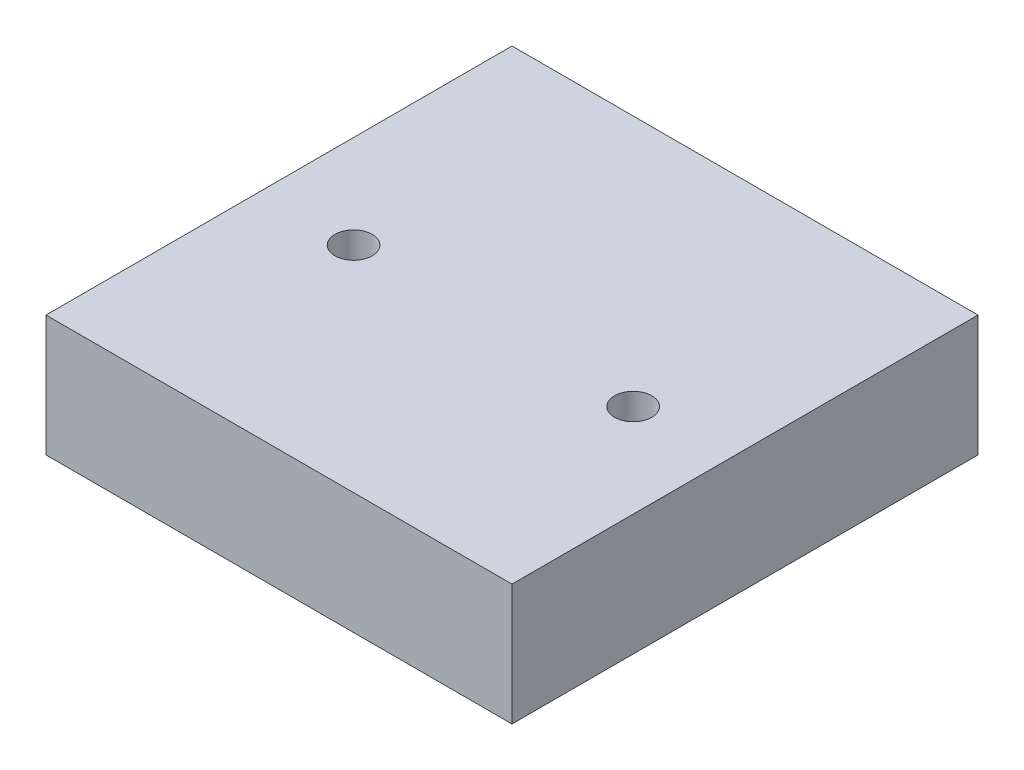
ISO-10303-21;
HEADER;
FILE_DESCRIPTION(('STEP AP214'),'2;1');
FILE_NAME('part.step','',(''),(''),'','','');
FILE_SCHEMA(('AUTOMOTIVE_DESIGN { 1 0 10303 214 1 1 1 1 }'));
ENDSEC;
DATA;
#1=APPLICATION_CONTEXT('core data for automotive mechanical design processes');
#2=APPLICATION_PROTOCOL_DEFINITION('international standard','automotive_design',2000,#1);
#3=PRODUCT_CONTEXT('',#1,'mechanical');
#4=PRODUCT('Part','Part','',(#3));
#5=PRODUCT_RELATED_PRODUCT_CATEGORY('part','',(#4));
#6=PRODUCT_DEFINITION_FORMATION('','',#4);
#7=PRODUCT_DEFINITION_CONTEXT('part definition',#1,'design');
#8=PRODUCT_DEFINITION('design','',#6,#7);
#9=PRODUCT_DEFINITION_SHAPE('','',#8);
#10=(LENGTH_UNIT() NAMED_UNIT(*) SI_UNIT(.MILLI.,.METRE.));
#11=(NAMED_UNIT(*) PLANE_ANGLE_UNIT() SI_UNIT($,.RADIAN.));
#12=(NAMED_UNIT(*) SI_UNIT($,.STERADIAN.) SOLID_ANGLE_UNIT());
#13=UNCERTAINTY_MEASURE_WITH_UNIT(LENGTH_MEASURE(1.E-05),#10,'distance_accuracy_value','');
#14=(GEOMETRIC_REPRESENTATION_CONTEXT(3) GLOBAL_UNCERTAINTY_ASSIGNED_CONTEXT((#13)) GLOBAL_UNIT_ASSIGNED_CONTEXT((#10,
#11,#12)) REPRESENTATION_CONTEXT('',''));
#15=CARTESIAN_POINT('',(0.,0.,0.));
#16=DIRECTION('',(0.,0.,1.));
#17=DIRECTION('',(1.,0.,0.));
#18=AXIS2_PLACEMENT_3D('',#15,#16,#17);
#19=CARTESIAN_POINT('',(25.,13.,25.));
#20=DIRECTION('',(-1.,0.,0.));
#21=DIRECTION('',(0.,0.,1.));
#22=AXIS2_PLACEMENT_3D('',#19,#20,#21);
#23=PLANE('',#22);
#24=DIRECTION('',(0.,0.,-1.));
#25=VECTOR('',#24,1.);
#26=CARTESIAN_POINT('',(25.,0.,25.));
#27=LINE('',#26,#25);
#28=CARTESIAN_POINT('',(25.,0.,25.));
#29=VERTEX_POINT('',#28);
#30=CARTESIAN_POINT('',(25.,0.,-25.));
#31=VERTEX_POINT('',#30);
#32=EDGE_CURVE('E102',#29,#31,#27,.T.);
#33=ORIENTED_EDGE('',*,*,#32,.T.);
#34=DIRECTION('',(0.,-1.,0.));
#35=VECTOR('',#34,1.);
#36=CARTESIAN_POINT('',(25.,13.,-25.));
#37=LINE('',#36,#35);
#38=CARTESIAN_POINT('',(25.,13.,-25.));
#39=VERTEX_POINT('',#38);
#40=EDGE_CURVE('E11',#39,#31,#37,.T.);
#41=ORIENTED_EDGE('',*,*,#40,.F.);
#42=DIRECTION('',(0.,0.,-1.));
#43=VECTOR('',#42,1.);
#44=CARTESIAN_POINT('',(25.,13.,25.));
#45=LINE('',#44,#43);
#46=CARTESIAN_POINT('',(25.,13.,25.));
#47=VERTEX_POINT('',#46);
#48=EDGE_CURVE('E90',#47,#39,#45,.T.);
#49=ORIENTED_EDGE('',*,*,#48,.F.);
#50=DIRECTION('',(0.,-1.,0.));
#51=VECTOR('',#50,1.);
#52=CARTESIAN_POINT('',(25.,13.,25.));
#53=LINE('',#52,#51);
#54=EDGE_CURVE('E98',#47,#29,#53,.T.);
#55=ORIENTED_EDGE('',*,*,#54,.T.);
#56=EDGE_LOOP('',(#33,#41,#49,#55));
#57=FACE_BOUND('',#56,.T.);
#58=ADVANCED_FACE('F39',(#57),#23,.F.);
#59=CARTESIAN_POINT('',(-25.,13.,-25.));
#60=DIRECTION('',(0.,0.,1.));
#61=DIRECTION('',(1.,0.,0.));
#62=AXIS2_PLACEMENT_3D('',#59,#60,#61);
#63=PLANE('',#62);
#64=DIRECTION('',(-1.,0.,0.));
#65=VECTOR('',#64,1.);
#66=CARTESIAN_POINT('',(-25.,0.,-25.));
#67=LINE('',#66,#65);
#68=CARTESIAN_POINT('',(-25.,0.,-25.));
#69=VERTEX_POINT('',#68);
#70=EDGE_CURVE('E94',#31,#69,#67,.T.);
#71=ORIENTED_EDGE('',*,*,#70,.T.);
#72=DIRECTION('',(0.,-1.,0.));
#73=VECTOR('',#72,1.);
#74=CARTESIAN_POINT('',(-25.,13.,-25.));
#75=LINE('',#74,#73);
#76=CARTESIAN_POINT('',(-25.,13.,-25.));
#77=VERTEX_POINT('',#76);
#78=EDGE_CURVE('E47',#77,#69,#75,.T.);
#79=ORIENTED_EDGE('',*,*,#78,.F.);
#80=DIRECTION('',(-1.,0.,0.));
#81=VECTOR('',#80,1.);
#82=CARTESIAN_POINT('',(-25.,13.,-25.));
#83=LINE('',#82,#81);
#84=EDGE_CURVE('E85',#39,#77,#83,.T.);
#85=ORIENTED_EDGE('',*,*,#84,.F.);
#86=ORIENTED_EDGE('',*,*,#40,.T.);
#87=EDGE_LOOP('',(#71,#79,#85,#86));
#88=FACE_BOUND('',#87,.T.);
#89=ADVANCED_FACE('F93',(#88),#63,.F.);
#90=CARTESIAN_POINT('',(-25.,13.,25.));
#91=DIRECTION('',(1.,0.,0.));
#92=DIRECTION('',(0.,0.,-1.));
#93=AXIS2_PLACEMENT_3D('',#90,#91,#92);
#94=PLANE('',#93);
#95=DIRECTION('',(0.,0.,1.));
#96=VECTOR('',#95,1.);
#97=CARTESIAN_POINT('',(-25.,0.,25.));
#98=LINE('',#97,#96);
#99=CARTESIAN_POINT('',(-25.,0.,25.));
#100=VERTEX_POINT('',#99);
#101=EDGE_CURVE('E72',#69,#100,#98,.T.);
#102=ORIENTED_EDGE('',*,*,#101,.T.);
#103=DIRECTION('',(0.,-1.,0.));
#104=VECTOR('',#103,1.);
#105=CARTESIAN_POINT('',(-25.,13.,25.));
#106=LINE('',#105,#104);
#107=CARTESIAN_POINT('',(-25.,13.,25.));
#108=VERTEX_POINT('',#107);
#109=EDGE_CURVE('E95',#108,#100,#106,.T.);
#110=ORIENTED_EDGE('',*,*,#109,.F.);
#111=DIRECTION('',(0.,0.,1.));
#112=VECTOR('',#111,1.);
#113=CARTESIAN_POINT('',(-25.,13.,25.));
#114=LINE('',#113,#112);
#115=EDGE_CURVE('E88',#77,#108,#114,.T.);
#116=ORIENTED_EDGE('',*,*,#115,.F.);
#117=ORIENTED_EDGE('',*,*,#78,.T.);
#118=EDGE_LOOP('',(#102,#110,#116,#117));
#119=FACE_BOUND('',#118,.T.);
#120=ADVANCED_FACE('F96',(#119),#94,.F.);
#121=CARTESIAN_POINT('',(-25.,13.,25.));
#122=DIRECTION('',(0.,0.,-1.));
#123=DIRECTION('',(-1.,0.,0.));
#124=AXIS2_PLACEMENT_3D('',#121,#122,#123);
#125=PLANE('',#124);
#126=DIRECTION('',(1.,0.,0.));
#127=VECTOR('',#126,1.);
#128=CARTESIAN_POINT('',(-25.,0.,25.));
#129=LINE('',#128,#127);
#130=EDGE_CURVE('E78',#100,#29,#129,.T.);
#131=ORIENTED_EDGE('',*,*,#130,.T.);
#132=ORIENTED_EDGE('',*,*,#54,.F.);
#133=DIRECTION('',(1.,0.,0.));
#134=VECTOR('',#133,1.);
#135=CARTESIAN_POINT('',(-25.,13.,25.));
#136=LINE('',#135,#134);
#137=EDGE_CURVE('E55',#108,#47,#136,.T.);
#138=ORIENTED_EDGE('',*,*,#137,.F.);
#139=ORIENTED_EDGE('',*,*,#109,.T.);
#140=EDGE_LOOP('',(#131,#132,#138,#139));
#141=FACE_BOUND('',#140,.T.);
#142=ADVANCED_FACE('F110',(#141),#125,.F.);
#143=CARTESIAN_POINT('',(0.,13.,0.));
#144=DIRECTION('',(0.,-1.,0.));
#145=DIRECTION('',(0.,0.,-1.));
#146=AXIS2_PLACEMENT_3D('',#143,#144,#145);
#147=PLANE('',#146);
#148=CARTESIAN_POINT('',(-15.,13.,2.));
#149=DIRECTION('',(0.,1.,0.));
#150=DIRECTION('',(0.,0.,1.));
#151=AXIS2_PLACEMENT_3D('',#148,#149,#150);
#152=CIRCLE('',#151,2.);
#153=CARTESIAN_POINT('',(-15.,13.,4.));
#154=VERTEX_POINT('',#153);
#155=EDGE_CURVE('E105',#154,#154,#152,.T.);
#156=ORIENTED_EDGE('',*,*,#155,.F.);
#157=EDGE_LOOP('',(#156));
#158=FACE_BOUND('',#157,.T.);
#159=CARTESIAN_POINT('',(15.,13.,2.));
#160=DIRECTION('',(0.,1.,0.));
#161=DIRECTION('',(0.,0.,1.));
#162=AXIS2_PLACEMENT_3D('',#159,#160,#161);
#163=CIRCLE('',#162,2.);
#164=CARTESIAN_POINT('',(15.,13.,4.));
#165=VERTEX_POINT('',#164);
#166=EDGE_CURVE('E116',#165,#165,#163,.T.);
#167=ORIENTED_EDGE('',*,*,#166,.F.);
#168=EDGE_LOOP('',(#167));
#169=FACE_BOUND('',#168,.T.);
#170=ORIENTED_EDGE('',*,*,#48,.T.);
#171=ORIENTED_EDGE('',*,*,#84,.T.);
#172=ORIENTED_EDGE('',*,*,#115,.T.);
#173=ORIENTED_EDGE('',*,*,#137,.T.);
#174=EDGE_LOOP('',(#170,#171,#172,#173));
#175=FACE_BOUND('',#174,.T.);
#176=ADVANCED_FACE('F86',(#158,#169,#175),#147,.F.);
#177=CARTESIAN_POINT('',(0.,0.,0.));
#178=DIRECTION('',(0.,-1.,0.));
#179=DIRECTION('',(0.,0.,-1.));
#180=AXIS2_PLACEMENT_3D('',#177,#178,#179);
#181=PLANE('',#180);
#182=CARTESIAN_POINT('',(-15.,0.,2.));
#183=DIRECTION('',(0.,-1.,0.));
#184=DIRECTION('',(0.,0.,-1.));
#185=AXIS2_PLACEMENT_3D('',#182,#183,#184);
#186=CIRCLE('',#185,2.);
#187=CARTESIAN_POINT('',(-15.,0.,0.));
#188=VERTEX_POINT('',#187);
#189=EDGE_CURVE('E122',#188,#188,#186,.F.);
#190=ORIENTED_EDGE('',*,*,#189,.T.);
#191=EDGE_LOOP('',(#190));
#192=FACE_BOUND('',#191,.T.);
#193=CARTESIAN_POINT('',(15.,0.,2.));
#194=DIRECTION('',(0.,-1.,0.));
#195=DIRECTION('',(0.,0.,-1.));
#196=AXIS2_PLACEMENT_3D('',#193,#194,#195);
#197=CIRCLE('',#196,2.);
#198=CARTESIAN_POINT('',(15.,0.,0.));
#199=VERTEX_POINT('',#198);
#200=EDGE_CURVE('E119',#199,#199,#197,.F.);
#201=ORIENTED_EDGE('',*,*,#200,.T.);
#202=EDGE_LOOP('',(#201));
#203=FACE_BOUND('',#202,.T.);
#204=ORIENTED_EDGE('',*,*,#32,.F.);
#205=ORIENTED_EDGE('',*,*,#130,.F.);
#206=ORIENTED_EDGE('',*,*,#101,.F.);
#207=ORIENTED_EDGE('',*,*,#70,.F.);
#208=EDGE_LOOP('',(#204,#205,#206,#207));
#209=FACE_BOUND('',#208,.T.);
#210=ADVANCED_FACE('F113',(#192,#203,#209),#181,.T.);
#211=CARTESIAN_POINT('',(15.,-0.000999999999999265,2.));
#212=DIRECTION('',(0.,1.,0.));
#213=DIRECTION('',(0.,0.,1.));
#214=AXIS2_PLACEMENT_3D('',#211,#212,#213);
#215=CYLINDRICAL_SURFACE('',#214,2.);
#216=ORIENTED_EDGE('',*,*,#200,.F.);
#217=EDGE_LOOP('',(#216));
#218=FACE_BOUND('',#217,.T.);
#219=ORIENTED_EDGE('',*,*,#166,.T.);
#220=EDGE_LOOP('',(#219));
#221=FACE_BOUND('',#220,.T.);
#222=ADVANCED_FACE('F135',(#218,#221),#215,.F.);
#223=CARTESIAN_POINT('',(-15.,-0.000999999999999265,2.));
#224=DIRECTION('',(0.,1.,0.));
#225=DIRECTION('',(0.,0.,1.));
#226=AXIS2_PLACEMENT_3D('',#223,#224,#225);
#227=CYLINDRICAL_SURFACE('',#226,2.);
#228=ORIENTED_EDGE('',*,*,#189,.F.);
#229=EDGE_LOOP('',(#228));
#230=FACE_BOUND('',#229,.T.);
#231=ORIENTED_EDGE('',*,*,#155,.T.);
#232=EDGE_LOOP('',(#231));
#233=FACE_BOUND('',#232,.T.);
#234=ADVANCED_FACE('F128',(#230,#233),#227,.F.);
#235=CLOSED_SHELL('',(#58,#89,#120,#142,#176,#210,#222,#234));
#236=MANIFOLD_SOLID_BREP('B2',#235);
#237=ADVANCED_BREP_SHAPE_REPRESENTATION('',(#18,#236),#14);
#238=SHAPE_DEFINITION_REPRESENTATION(#9,#237);
ENDSEC;
END-ISO-10303-21;
